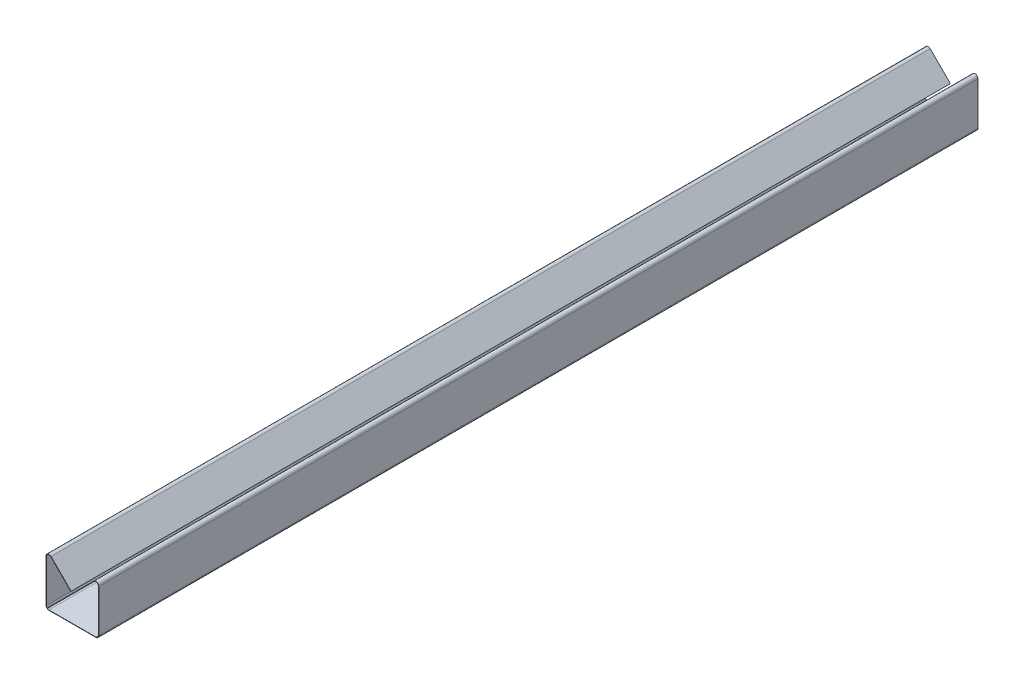
ISO-10303-21;
HEADER;
FILE_DESCRIPTION(('STEP AP214'),'2;1');
FILE_NAME('part.step','',(''),(''),'','','');
FILE_SCHEMA(('AUTOMOTIVE_DESIGN { 1 0 10303 214 1 1 1 1 }'));
ENDSEC;
DATA;
#1=APPLICATION_CONTEXT('core data for automotive mechanical design processes');
#2=APPLICATION_PROTOCOL_DEFINITION('international standard','automotive_design',2000,#1);
#3=PRODUCT_CONTEXT('',#1,'mechanical');
#4=PRODUCT('Part','Part','',(#3));
#5=PRODUCT_RELATED_PRODUCT_CATEGORY('part','',(#4));
#6=PRODUCT_DEFINITION_FORMATION('','',#4);
#7=PRODUCT_DEFINITION_CONTEXT('part definition',#1,'design');
#8=PRODUCT_DEFINITION('design','',#6,#7);
#9=PRODUCT_DEFINITION_SHAPE('','',#8);
#10=(LENGTH_UNIT() NAMED_UNIT(*) SI_UNIT(.MILLI.,.METRE.));
#11=(NAMED_UNIT(*) PLANE_ANGLE_UNIT() SI_UNIT($,.RADIAN.));
#12=(NAMED_UNIT(*) SI_UNIT($,.STERADIAN.) SOLID_ANGLE_UNIT());
#13=UNCERTAINTY_MEASURE_WITH_UNIT(LENGTH_MEASURE(1.E-05),#10,'distance_accuracy_value','');
#14=(GEOMETRIC_REPRESENTATION_CONTEXT(3) GLOBAL_UNCERTAINTY_ASSIGNED_CONTEXT((#13)) GLOBAL_UNIT_ASSIGNED_CONTEXT((#10,
#11,#12)) REPRESENTATION_CONTEXT('',''));
#15=CARTESIAN_POINT('',(0.,0.,0.));
#16=DIRECTION('',(0.,0.,1.));
#17=DIRECTION('',(1.,0.,0.));
#18=AXIS2_PLACEMENT_3D('',#15,#16,#17);
#19=CARTESIAN_POINT('',(7.49999999999994,5.48026893371868,250.));
#20=DIRECTION('',(0.,0.,1.));
#21=DIRECTION('',(1.,0.,0.));
#22=AXIS2_PLACEMENT_3D('',#19,#20,#21);
#23=PLANE('',#22);
#24=DIRECTION('',(-1.,0.,0.));
#25=VECTOR('',#24,1.);
#26=CARTESIAN_POINT('',(7.49999999999994,5.48026893371868,250.));
#27=LINE('',#26,#25);
#28=CARTESIAN_POINT('',(7.49999999999994,5.48026893371868,250.));
#29=VERTEX_POINT('',#28);
#30=CARTESIAN_POINT('',(7.39999999999994,5.48026893371868,250.));
#31=VERTEX_POINT('',#30);
#32=EDGE_CURVE('E11',#29,#31,#27,.T.);
#33=ORIENTED_EDGE('',*,*,#32,.F.);
#34=CARTESIAN_POINT('',(6.66339999999994,5.48026893371868,250.));
#35=DIRECTION('',(0.,0.,1.));
#36=DIRECTION('',(1.,0.,0.));
#37=AXIS2_PLACEMENT_3D('',#34,#35,#36);
#38=CIRCLE('',#37,0.8366);
#39=CARTESIAN_POINT('',(6.07183446685927,6.07183446685934,250.));
#40=VERTEX_POINT('',#39);
#41=EDGE_CURVE('E364',#40,#29,#38,.F.);
#42=ORIENTED_EDGE('',*,*,#41,.F.);
#43=DIRECTION('',(-0.707106781186552,0.707106781186543,0.));
#44=VECTOR('',#43,1.);
#45=CARTESIAN_POINT('',(6.14254514497793,6.00112378874069,250.));
#46=LINE('',#45,#44);
#47=CARTESIAN_POINT('',(6.14254514497793,6.00112378874069,250.));
#48=VERTEX_POINT('',#47);
#49=EDGE_CURVE('E43',#48,#40,#46,.T.);
#50=ORIENTED_EDGE('',*,*,#49,.F.);
#51=CARTESIAN_POINT('',(6.66339999999994,5.48026893371868,250.));
#52=DIRECTION('',(0.,0.,1.));
#53=DIRECTION('',(1.,0.,0.));
#54=AXIS2_PLACEMENT_3D('',#51,#52,#53);
#55=CIRCLE('',#54,0.7366);
#56=EDGE_CURVE('E377',#48,#31,#55,.F.);
#57=ORIENTED_EDGE('',*,*,#56,.T.);
#58=EDGE_LOOP('',(#33,#42,#50,#57));
#59=FACE_BOUND('',#58,.T.);
#60=ADVANCED_FACE('F35',(#59),#23,.T.);
#61=CARTESIAN_POINT('',(6.14254514497793,6.00112378874069,250.));
#62=DIRECTION('',(0.,0.,1.));
#63=DIRECTION('',(1.,0.,0.));
#64=AXIS2_PLACEMENT_3D('',#61,#62,#63);
#65=PLANE('',#64);
#66=DIRECTION('',(0.,-1.,0.));
#67=VECTOR('',#66,1.);
#68=CARTESIAN_POINT('',(7.49999999999994,-7.49999999999997,250.));
#69=LINE('',#68,#67);
#70=CARTESIAN_POINT('',(7.49999999999994,-6.66339999999997,250.));
#71=VERTEX_POINT('',#70);
#72=EDGE_CURVE('E368',#29,#71,#69,.T.);
#73=ORIENTED_EDGE('',*,*,#72,.F.);
#74=ORIENTED_EDGE('',*,*,#32,.T.);
#75=DIRECTION('',(0.,1.,0.));
#76=VECTOR('',#75,1.);
#77=CARTESIAN_POINT('',(7.39999999999994,-7.49999999999997,250.));
#78=LINE('',#77,#76);
#79=CARTESIAN_POINT('',(7.39999999999994,-6.66339999999997,250.));
#80=VERTEX_POINT('',#79);
#81=EDGE_CURVE('E379',#31,#80,#78,.F.);
#82=ORIENTED_EDGE('',*,*,#81,.T.);
#83=DIRECTION('',(1.,0.,0.));
#84=VECTOR('',#83,1.);
#85=CARTESIAN_POINT('',(7.39999999999994,-6.66339999999997,250.));
#86=LINE('',#85,#84);
#87=EDGE_CURVE('E338',#80,#71,#86,.T.);
#88=ORIENTED_EDGE('',*,*,#87,.T.);
#89=EDGE_LOOP('',(#73,#74,#82,#88));
#90=FACE_BOUND('',#89,.T.);
#91=ADVANCED_FACE('F448',(#90),#65,.T.);
#92=CARTESIAN_POINT('',(6.07183446685927,6.07183446685934,0.));
#93=DIRECTION('',(0.,0.,-1.));
#94=DIRECTION('',(-1.,0.,0.));
#95=AXIS2_PLACEMENT_3D('',#92,#93,#94);
#96=PLANE('',#95);
#97=DIRECTION('',(0.707106781186552,-0.707106781186543,0.));
#98=VECTOR('',#97,1.);
#99=CARTESIAN_POINT('',(6.07183446685927,6.07183446685934,0.));
#100=LINE('',#99,#98);
#101=CARTESIAN_POINT('',(6.07183446685927,6.07183446685934,0.));
#102=VERTEX_POINT('',#101);
#103=CARTESIAN_POINT('',(6.14254514497793,6.00112378874069,0.));
#104=VERTEX_POINT('',#103);
#105=EDGE_CURVE('E344',#102,#104,#100,.T.);
#106=ORIENTED_EDGE('',*,*,#105,.F.);
#107=CARTESIAN_POINT('',(6.66339999999994,5.48026893371868,0.));
#108=DIRECTION('',(0.,0.,1.));
#109=DIRECTION('',(1.,0.,0.));
#110=AXIS2_PLACEMENT_3D('',#107,#108,#109);
#111=CIRCLE('',#110,0.8366);
#112=CARTESIAN_POINT('',(7.49999999999994,5.48026893371868,0.));
#113=VERTEX_POINT('',#112);
#114=EDGE_CURVE('E248',#102,#113,#111,.F.);
#115=ORIENTED_EDGE('',*,*,#114,.T.);
#116=DIRECTION('',(1.,0.,0.));
#117=VECTOR('',#116,1.);
#118=CARTESIAN_POINT('',(7.39999999999994,5.48026893371868,0.));
#119=LINE('',#118,#117);
#120=CARTESIAN_POINT('',(7.39999999999994,5.48026893371868,0.));
#121=VERTEX_POINT('',#120);
#122=EDGE_CURVE('E342',#121,#113,#119,.T.);
#123=ORIENTED_EDGE('',*,*,#122,.F.);
#124=CARTESIAN_POINT('',(6.66339999999994,5.48026893371868,0.));
#125=DIRECTION('',(0.,0.,1.));
#126=DIRECTION('',(1.,0.,0.));
#127=AXIS2_PLACEMENT_3D('',#124,#125,#126);
#128=CIRCLE('',#127,0.7366);
#129=EDGE_CURVE('E260',#104,#121,#128,.F.);
#130=ORIENTED_EDGE('',*,*,#129,.F.);
#131=EDGE_LOOP('',(#106,#115,#123,#130));
#132=FACE_BOUND('',#131,.T.);
#133=ADVANCED_FACE('F490',(#132),#96,.T.);
#134=CARTESIAN_POINT('',(7.39999999999994,5.48026893371868,0.));
#135=DIRECTION('',(0.,0.,-1.));
#136=DIRECTION('',(-1.,0.,0.));
#137=AXIS2_PLACEMENT_3D('',#134,#135,#136);
#138=PLANE('',#137);
#139=DIRECTION('',(0.707106781186544,0.707106781186551,0.));
#140=VECTOR('',#139,1.);
#141=CARTESIAN_POINT('',(7.49999999999994,7.50000000000003,0.));
#142=LINE('',#141,#140);
#143=CARTESIAN_POINT('',(-7.1464466094067,-7.14644660940678,0.));
#144=VERTEX_POINT('',#143);
#145=EDGE_CURVE('E251',#144,#102,#142,.T.);
#146=ORIENTED_EDGE('',*,*,#145,.T.);
#147=ORIENTED_EDGE('',*,*,#105,.T.);
#148=DIRECTION('',(0.707106781186544,0.707106781186551,0.));
#149=VECTOR('',#148,1.);
#150=CARTESIAN_POINT('',(7.5707106781186,7.42928932188137,0.));
#151=LINE('',#150,#149);
#152=CARTESIAN_POINT('',(-7.07573593128805,-7.21715728752544,0.));
#153=VERTEX_POINT('',#152);
#154=EDGE_CURVE('E257',#153,#104,#151,.T.);
#155=ORIENTED_EDGE('',*,*,#154,.F.);
#156=DIRECTION('',(-0.707106781186487,0.707106781186608,0.));
#157=VECTOR('',#156,1.);
#158=CARTESIAN_POINT('',(-7.07573593128805,-7.21715728752544,0.));
#159=LINE('',#158,#157);
#160=EDGE_CURVE('E254',#153,#144,#159,.T.);
#161=ORIENTED_EDGE('',*,*,#160,.T.);
#162=EDGE_LOOP('',(#146,#147,#155,#161));
#163=FACE_BOUND('',#162,.T.);
#164=ADVANCED_FACE('F494',(#163),#138,.T.);
#165=CARTESIAN_POINT('',(6.66339999999994,-7.49999999999997,250.));
#166=DIRECTION('',(0.,0.,1.));
#167=DIRECTION('',(1.,0.,0.));
#168=AXIS2_PLACEMENT_3D('',#165,#166,#167);
#169=PLANE('',#168);
#170=DIRECTION('',(0.,1.,0.));
#171=VECTOR('',#170,1.);
#172=CARTESIAN_POINT('',(6.66339999999994,-7.49999999999997,250.));
#173=LINE('',#172,#171);
#174=CARTESIAN_POINT('',(6.66339999999994,-7.49999999999997,250.));
#175=VERTEX_POINT('',#174);
#176=CARTESIAN_POINT('',(6.66339999999994,-7.39999999999997,250.));
#177=VERTEX_POINT('',#176);
#178=EDGE_CURVE('E340',#175,#177,#173,.T.);
#179=ORIENTED_EDGE('',*,*,#178,.F.);
#180=CARTESIAN_POINT('',(6.66339999999994,-6.66339999999997,250.));
#181=DIRECTION('',(0.,0.,1.));
#182=DIRECTION('',(1.,0.,0.));
#183=AXIS2_PLACEMENT_3D('',#180,#181,#182);
#184=CIRCLE('',#183,0.8366);
#185=EDGE_CURVE('E438',#71,#175,#184,.F.);
#186=ORIENTED_EDGE('',*,*,#185,.F.);
#187=ORIENTED_EDGE('',*,*,#87,.F.);
#188=CARTESIAN_POINT('',(6.66339999999994,-6.66339999999997,250.));
#189=DIRECTION('',(0.,0.,1.));
#190=DIRECTION('',(1.,0.,0.));
#191=AXIS2_PLACEMENT_3D('',#188,#189,#190);
#192=CIRCLE('',#191,0.7366);
#193=EDGE_CURVE('E382',#80,#177,#192,.F.);
#194=ORIENTED_EDGE('',*,*,#193,.T.);
#195=EDGE_LOOP('',(#179,#186,#187,#194));
#196=FACE_BOUND('',#195,.T.);
#197=ADVANCED_FACE('F455',(#196),#169,.T.);
#198=CARTESIAN_POINT('',(7.39999999999994,-6.66339999999997,250.));
#199=DIRECTION('',(0.,0.,1.));
#200=DIRECTION('',(1.,0.,0.));
#201=AXIS2_PLACEMENT_3D('',#198,#199,#200);
#202=PLANE('',#201);
#203=DIRECTION('',(-1.,0.,0.));
#204=VECTOR('',#203,1.);
#205=CARTESIAN_POINT('',(-7.50000000000006,-7.49999999999997,250.));
#206=LINE('',#205,#204);
#207=CARTESIAN_POINT('',(-6.66340000000006,-7.49999999999997,250.));
#208=VERTEX_POINT('',#207);
#209=EDGE_CURVE('E435',#175,#208,#206,.T.);
#210=ORIENTED_EDGE('',*,*,#209,.F.);
#211=ORIENTED_EDGE('',*,*,#178,.T.);
#212=DIRECTION('',(1.,0.,0.));
#213=VECTOR('',#212,1.);
#214=CARTESIAN_POINT('',(-7.50000000000006,-7.39999999999997,250.));
#215=LINE('',#214,#213);
#216=CARTESIAN_POINT('',(-6.66340000000006,-7.39999999999997,250.));
#217=VERTEX_POINT('',#216);
#218=EDGE_CURVE('E202',#177,#217,#215,.F.);
#219=ORIENTED_EDGE('',*,*,#218,.T.);
#220=DIRECTION('',(0.,-1.,0.));
#221=VECTOR('',#220,1.);
#222=CARTESIAN_POINT('',(-6.66340000000006,-7.39999999999997,250.));
#223=LINE('',#222,#221);
#224=EDGE_CURVE('E193',#217,#208,#223,.T.);
#225=ORIENTED_EDGE('',*,*,#224,.T.);
#226=EDGE_LOOP('',(#210,#211,#219,#225));
#227=FACE_BOUND('',#226,.T.);
#228=ADVANCED_FACE('F388',(#227),#202,.T.);
#229=CARTESIAN_POINT('',(7.49999999999994,-6.66339999999997,0.));
#230=DIRECTION('',(0.,0.,-1.));
#231=DIRECTION('',(-1.,0.,0.));
#232=AXIS2_PLACEMENT_3D('',#229,#230,#231);
#233=PLANE('',#232);
#234=DIRECTION('',(-1.,0.,0.));
#235=VECTOR('',#234,1.);
#236=CARTESIAN_POINT('',(7.49999999999994,-6.66339999999997,0.));
#237=LINE('',#236,#235);
#238=CARTESIAN_POINT('',(7.49999999999994,-6.66339999999997,0.));
#239=VERTEX_POINT('',#238);
#240=CARTESIAN_POINT('',(7.39999999999994,-6.66339999999997,0.));
#241=VERTEX_POINT('',#240);
#242=EDGE_CURVE('E336',#239,#241,#237,.T.);
#243=ORIENTED_EDGE('',*,*,#242,.F.);
#244=CARTESIAN_POINT('',(6.66339999999994,-6.66339999999997,0.));
#245=DIRECTION('',(0.,0.,1.));
#246=DIRECTION('',(1.,0.,0.));
#247=AXIS2_PLACEMENT_3D('',#244,#245,#246);
#248=CIRCLE('',#247,0.8366);
#249=CARTESIAN_POINT('',(6.66339999999994,-7.49999999999997,0.));
#250=VERTEX_POINT('',#249);
#251=EDGE_CURVE('E242',#239,#250,#248,.F.);
#252=ORIENTED_EDGE('',*,*,#251,.T.);
#253=DIRECTION('',(0.,-1.,0.));
#254=VECTOR('',#253,1.);
#255=CARTESIAN_POINT('',(6.66339999999994,-7.39999999999997,0.));
#256=LINE('',#255,#254);
#257=CARTESIAN_POINT('',(6.66339999999994,-7.39999999999997,0.));
#258=VERTEX_POINT('',#257);
#259=EDGE_CURVE('E192',#258,#250,#256,.T.);
#260=ORIENTED_EDGE('',*,*,#259,.F.);
#261=CARTESIAN_POINT('',(6.66339999999994,-6.66339999999997,0.));
#262=DIRECTION('',(0.,0.,1.));
#263=DIRECTION('',(1.,0.,0.));
#264=AXIS2_PLACEMENT_3D('',#261,#262,#263);
#265=CIRCLE('',#264,0.7366);
#266=EDGE_CURVE('E266',#241,#258,#265,.F.);
#267=ORIENTED_EDGE('',*,*,#266,.F.);
#268=EDGE_LOOP('',(#243,#252,#260,#267));
#269=FACE_BOUND('',#268,.T.);
#270=ADVANCED_FACE('F464',(#269),#233,.T.);
#271=CARTESIAN_POINT('',(6.66339999999994,-7.39999999999997,0.));
#272=DIRECTION('',(0.,0.,-1.));
#273=DIRECTION('',(-1.,0.,0.));
#274=AXIS2_PLACEMENT_3D('',#271,#272,#273);
#275=PLANE('',#274);
#276=DIRECTION('',(0.,-1.,0.));
#277=VECTOR('',#276,1.);
#278=CARTESIAN_POINT('',(7.49999999999994,-7.49999999999997,0.));
#279=LINE('',#278,#277);
#280=EDGE_CURVE('E245',#113,#239,#279,.T.);
#281=ORIENTED_EDGE('',*,*,#280,.T.);
#282=ORIENTED_EDGE('',*,*,#242,.T.);
#283=DIRECTION('',(0.,1.,0.));
#284=VECTOR('',#283,1.);
#285=CARTESIAN_POINT('',(7.39999999999994,-7.49999999999997,0.));
#286=LINE('',#285,#284);
#287=EDGE_CURVE('E263',#121,#241,#286,.F.);
#288=ORIENTED_EDGE('',*,*,#287,.F.);
#289=ORIENTED_EDGE('',*,*,#122,.T.);
#290=EDGE_LOOP('',(#281,#282,#288,#289));
#291=FACE_BOUND('',#290,.T.);
#292=ADVANCED_FACE('F468',(#291),#275,.T.);
#293=CARTESIAN_POINT('',(-7.50000000000006,-6.66339999999997,250.));
#294=DIRECTION('',(0.,0.,1.));
#295=DIRECTION('',(1.,0.,0.));
#296=AXIS2_PLACEMENT_3D('',#293,#294,#295);
#297=PLANE('',#296);
#298=DIRECTION('',(1.,0.,0.));
#299=VECTOR('',#298,1.);
#300=CARTESIAN_POINT('',(-7.50000000000006,-6.66339999999997,250.));
#301=LINE('',#300,#299);
#302=CARTESIAN_POINT('',(-7.50000000000006,-6.66339999999997,250.));
#303=VERTEX_POINT('',#302);
#304=CARTESIAN_POINT('',(-7.40000000000005,-6.66339999999997,250.));
#305=VERTEX_POINT('',#304);
#306=EDGE_CURVE('E180',#303,#305,#301,.T.);
#307=ORIENTED_EDGE('',*,*,#306,.F.);
#308=CARTESIAN_POINT('',(-6.66340000000006,-6.66339999999997,250.));
#309=DIRECTION('',(0.,0.,1.));
#310=DIRECTION('',(1.,0.,0.));
#311=AXIS2_PLACEMENT_3D('',#308,#309,#310);
#312=CIRCLE('',#311,0.8366);
#313=EDGE_CURVE('E400',#208,#303,#312,.F.);
#314=ORIENTED_EDGE('',*,*,#313,.F.);
#315=ORIENTED_EDGE('',*,*,#224,.F.);
#316=CARTESIAN_POINT('',(-6.66340000000006,-6.66339999999997,250.));
#317=DIRECTION('',(0.,0.,1.));
#318=DIRECTION('',(1.,0.,0.));
#319=AXIS2_PLACEMENT_3D('',#316,#317,#318);
#320=CIRCLE('',#319,0.7366);
#321=EDGE_CURVE('E196',#217,#305,#320,.F.);
#322=ORIENTED_EDGE('',*,*,#321,.T.);
#323=EDGE_LOOP('',(#307,#314,#315,#322));
#324=FACE_BOUND('',#323,.T.);
#325=ADVANCED_FACE('F198',(#324),#297,.T.);
#326=CARTESIAN_POINT('',(-6.66340000000006,-7.39999999999997,250.));
#327=DIRECTION('',(0.,0.,1.));
#328=DIRECTION('',(1.,0.,0.));
#329=AXIS2_PLACEMENT_3D('',#326,#327,#328);
#330=PLANE('',#329);
#331=DIRECTION('',(0.,1.,0.));
#332=VECTOR('',#331,1.);
#333=CARTESIAN_POINT('',(-7.50000000000006,7.50000000000003,250.));
#334=LINE('',#333,#332);
#335=CARTESIAN_POINT('',(-7.50000000000006,5.4802689337187,250.));
#336=VERTEX_POINT('',#335);
#337=EDGE_CURVE('E187',#303,#336,#334,.T.);
#338=ORIENTED_EDGE('',*,*,#337,.F.);
#339=ORIENTED_EDGE('',*,*,#306,.T.);
#340=DIRECTION('',(0.,1.,0.));
#341=VECTOR('',#340,1.);
#342=CARTESIAN_POINT('',(-7.40000000000006,7.50000000000003,250.));
#343=LINE('',#342,#341);
#344=CARTESIAN_POINT('',(-7.40000000000006,5.4802689337187,250.));
#345=VERTEX_POINT('',#344);
#346=EDGE_CURVE('E184',#305,#345,#343,.T.);
#347=ORIENTED_EDGE('',*,*,#346,.T.);
#348=DIRECTION('',(-1.,0.,0.));
#349=VECTOR('',#348,1.);
#350=CARTESIAN_POINT('',(-7.40000000000006,5.4802689337187,250.));
#351=LINE('',#350,#349);
#352=EDGE_CURVE('E327',#345,#336,#351,.T.);
#353=ORIENTED_EDGE('',*,*,#352,.T.);
#354=EDGE_LOOP('',(#338,#339,#347,#353));
#355=FACE_BOUND('',#354,.T.);
#356=ADVANCED_FACE('F182',(#355),#330,.T.);
#357=CARTESIAN_POINT('',(-6.66340000000006,-7.49999999999997,0.));
#358=DIRECTION('',(0.,0.,-1.));
#359=DIRECTION('',(-1.,0.,0.));
#360=AXIS2_PLACEMENT_3D('',#357,#358,#359);
#361=PLANE('',#360);
#362=DIRECTION('',(0.,1.,0.));
#363=VECTOR('',#362,1.);
#364=CARTESIAN_POINT('',(-6.66340000000006,-7.49999999999997,0.));
#365=LINE('',#364,#363);
#366=CARTESIAN_POINT('',(-6.66340000000006,-7.49999999999997,0.));
#367=VERTEX_POINT('',#366);
#368=CARTESIAN_POINT('',(-6.66340000000006,-7.39999999999997,0.));
#369=VERTEX_POINT('',#368);
#370=EDGE_CURVE('E332',#367,#369,#365,.T.);
#371=ORIENTED_EDGE('',*,*,#370,.F.);
#372=CARTESIAN_POINT('',(-6.66340000000006,-6.66339999999997,0.));
#373=DIRECTION('',(0.,0.,1.));
#374=DIRECTION('',(1.,0.,0.));
#375=AXIS2_PLACEMENT_3D('',#372,#373,#374);
#376=CIRCLE('',#375,0.8366);
#377=CARTESIAN_POINT('',(-7.50000000000006,-6.66339999999997,0.));
#378=VERTEX_POINT('',#377);
#379=EDGE_CURVE('E236',#367,#378,#376,.F.);
#380=ORIENTED_EDGE('',*,*,#379,.T.);
#381=DIRECTION('',(-1.,0.,0.));
#382=VECTOR('',#381,1.);
#383=CARTESIAN_POINT('',(-7.40000000000005,-6.66339999999997,0.));
#384=LINE('',#383,#382);
#385=CARTESIAN_POINT('',(-7.40000000000005,-6.66339999999997,0.));
#386=VERTEX_POINT('',#385);
#387=EDGE_CURVE('E330',#386,#378,#384,.T.);
#388=ORIENTED_EDGE('',*,*,#387,.F.);
#389=CARTESIAN_POINT('',(-6.66340000000006,-6.66339999999997,0.));
#390=DIRECTION('',(0.,0.,1.));
#391=DIRECTION('',(1.,0.,0.));
#392=AXIS2_PLACEMENT_3D('',#389,#390,#391);
#393=CIRCLE('',#392,0.7366);
#394=EDGE_CURVE('E209',#369,#386,#393,.F.);
#395=ORIENTED_EDGE('',*,*,#394,.F.);
#396=EDGE_LOOP('',(#371,#380,#388,#395));
#397=FACE_BOUND('',#396,.T.);
#398=ADVANCED_FACE('F394',(#397),#361,.T.);
#399=CARTESIAN_POINT('',(-7.40000000000005,-6.66339999999997,0.));
#400=DIRECTION('',(0.,0.,-1.));
#401=DIRECTION('',(-1.,0.,0.));
#402=AXIS2_PLACEMENT_3D('',#399,#400,#401);
#403=PLANE('',#402);
#404=DIRECTION('',(-1.,0.,0.));
#405=VECTOR('',#404,1.);
#406=CARTESIAN_POINT('',(-7.50000000000006,-7.49999999999997,0.));
#407=LINE('',#406,#405);
#408=EDGE_CURVE('E239',#250,#367,#407,.T.);
#409=ORIENTED_EDGE('',*,*,#408,.T.);
#410=ORIENTED_EDGE('',*,*,#370,.T.);
#411=DIRECTION('',(1.,0.,0.));
#412=VECTOR('',#411,1.);
#413=CARTESIAN_POINT('',(-7.50000000000006,-7.39999999999997,0.));
#414=LINE('',#413,#412);
#415=EDGE_CURVE('E269',#258,#369,#414,.F.);
#416=ORIENTED_EDGE('',*,*,#415,.F.);
#417=ORIENTED_EDGE('',*,*,#259,.T.);
#418=EDGE_LOOP('',(#409,#410,#416,#417));
#419=FACE_BOUND('',#418,.T.);
#420=ADVANCED_FACE('F474',(#419),#403,.T.);
#421=CARTESIAN_POINT('',(-6.07183446685939,6.07183446685937,250.));
#422=DIRECTION('',(0.,0.,1.));
#423=DIRECTION('',(1.,0.,0.));
#424=AXIS2_PLACEMENT_3D('',#421,#422,#423);
#425=PLANE('',#424);
#426=DIRECTION('',(-0.707106781186548,-0.707106781186548,0.));
#427=VECTOR('',#426,1.);
#428=CARTESIAN_POINT('',(-6.07183446685939,6.07183446685937,250.));
#429=LINE('',#428,#427);
#430=CARTESIAN_POINT('',(-6.07183446685939,6.07183446685937,250.));
#431=VERTEX_POINT('',#430);
#432=CARTESIAN_POINT('',(-6.14254514497805,6.00112378874071,250.));
#433=VERTEX_POINT('',#432);
#434=EDGE_CURVE('E51',#431,#433,#429,.T.);
#435=ORIENTED_EDGE('',*,*,#434,.F.);
#436=CARTESIAN_POINT('',(-6.66340000000006,5.4802689337187,250.));
#437=DIRECTION('',(0.,0.,1.));
#438=DIRECTION('',(1.,0.,0.));
#439=AXIS2_PLACEMENT_3D('',#436,#437,#438);
#440=CIRCLE('',#439,0.8366);
#441=EDGE_CURVE('E428',#336,#431,#440,.F.);
#442=ORIENTED_EDGE('',*,*,#441,.F.);
#443=ORIENTED_EDGE('',*,*,#352,.F.);
#444=CARTESIAN_POINT('',(-6.66340000000006,5.4802689337187,250.));
#445=DIRECTION('',(0.,0.,1.));
#446=DIRECTION('',(1.,0.,0.));
#447=AXIS2_PLACEMENT_3D('',#444,#445,#446);
#448=CIRCLE('',#447,0.7366);
#449=EDGE_CURVE('E217',#345,#433,#448,.F.);
#450=ORIENTED_EDGE('',*,*,#449,.T.);
#451=EDGE_LOOP('',(#435,#442,#443,#450));
#452=FACE_BOUND('',#451,.T.);
#453=ADVANCED_FACE('F476',(#452),#425,.T.);
#454=CARTESIAN_POINT('',(-7.40000000000006,5.4802689337187,250.));
#455=DIRECTION('',(0.,0.,1.));
#456=DIRECTION('',(1.,0.,0.));
#457=AXIS2_PLACEMENT_3D('',#454,#455,#456);
#458=PLANE('',#457);
#459=DIRECTION('',(0.707106781186549,-0.707106781186546,0.));
#460=VECTOR('',#459,1.);
#461=CARTESIAN_POINT('',(-7.50000000000006,7.50000000000003,250.));
#462=LINE('',#461,#460);
#463=CARTESIAN_POINT('',(-0.353553390593274,0.353553390593273,250.));
#464=VERTEX_POINT('',#463);
#465=EDGE_CURVE('E426',#431,#464,#462,.T.);
#466=ORIENTED_EDGE('',*,*,#465,.F.);
#467=ORIENTED_EDGE('',*,*,#434,.T.);
#468=DIRECTION('',(0.707106781186549,-0.707106781186546,0.));
#469=VECTOR('',#468,1.);
#470=CARTESIAN_POINT('',(-7.57071067811871,7.42928932188137,250.));
#471=LINE('',#470,#469);
#472=CARTESIAN_POINT('',(-0.42426406871193,0.282842712474619,250.));
#473=VERTEX_POINT('',#472);
#474=EDGE_CURVE('E129',#433,#473,#471,.T.);
#475=ORIENTED_EDGE('',*,*,#474,.T.);
#476=DIRECTION('',(-0.707106781186556,-0.707106781186539,0.));
#477=VECTOR('',#476,1.);
#478=CARTESIAN_POINT('',(-0.353553390593274,0.353553390593273,250.));
#479=LINE('',#478,#477);
#480=EDGE_CURVE('E424',#464,#473,#479,.T.);
#481=ORIENTED_EDGE('',*,*,#480,.F.);
#482=EDGE_LOOP('',(#466,#467,#475,#481));
#483=FACE_BOUND('',#482,.T.);
#484=ADVANCED_FACE('F482',(#483),#458,.T.);
#485=CARTESIAN_POINT('',(-7.50000000000006,5.4802689337187,0.));
#486=DIRECTION('',(0.,0.,-1.));
#487=DIRECTION('',(-1.,0.,0.));
#488=AXIS2_PLACEMENT_3D('',#485,#486,#487);
#489=PLANE('',#488);
#490=DIRECTION('',(1.,0.,0.));
#491=VECTOR('',#490,1.);
#492=CARTESIAN_POINT('',(-7.50000000000006,5.4802689337187,0.));
#493=LINE('',#492,#491);
#494=CARTESIAN_POINT('',(-7.50000000000006,5.4802689337187,0.));
#495=VERTEX_POINT('',#494);
#496=CARTESIAN_POINT('',(-7.40000000000006,5.4802689337187,0.));
#497=VERTEX_POINT('',#496);
#498=EDGE_CURVE('E116',#495,#497,#493,.T.);
#499=ORIENTED_EDGE('',*,*,#498,.F.);
#500=CARTESIAN_POINT('',(-6.66340000000006,5.4802689337187,0.));
#501=DIRECTION('',(0.,0.,1.));
#502=DIRECTION('',(1.,0.,0.));
#503=AXIS2_PLACEMENT_3D('',#500,#501,#502);
#504=CIRCLE('',#503,0.8366);
#505=CARTESIAN_POINT('',(-6.07183446685939,6.07183446685937,0.));
#506=VERTEX_POINT('',#505);
#507=EDGE_CURVE('E232',#495,#506,#504,.F.);
#508=ORIENTED_EDGE('',*,*,#507,.T.);
#509=DIRECTION('',(0.707106781186548,0.707106781186548,0.));
#510=VECTOR('',#509,1.);
#511=CARTESIAN_POINT('',(-6.14254514497805,6.00112378874071,0.));
#512=LINE('',#511,#510);
#513=CARTESIAN_POINT('',(-6.14254514497805,6.00112378874071,0.));
#514=VERTEX_POINT('',#513);
#515=EDGE_CURVE('E123',#514,#506,#512,.T.);
#516=ORIENTED_EDGE('',*,*,#515,.F.);
#517=CARTESIAN_POINT('',(-6.66340000000006,5.4802689337187,0.));
#518=DIRECTION('',(0.,0.,1.));
#519=DIRECTION('',(1.,0.,0.));
#520=AXIS2_PLACEMENT_3D('',#517,#518,#519);
#521=CIRCLE('',#520,0.7366);
#522=EDGE_CURVE('E275',#497,#514,#521,.F.);
#523=ORIENTED_EDGE('',*,*,#522,.F.);
#524=EDGE_LOOP('',(#499,#508,#516,#523));
#525=FACE_BOUND('',#524,.T.);
#526=ADVANCED_FACE('F411',(#525),#489,.T.);
#527=CARTESIAN_POINT('',(-6.14254514497805,6.00112378874071,0.));
#528=DIRECTION('',(0.,0.,-1.));
#529=DIRECTION('',(-1.,0.,0.));
#530=AXIS2_PLACEMENT_3D('',#527,#528,#529);
#531=PLANE('',#530);
#532=DIRECTION('',(0.,1.,0.));
#533=VECTOR('',#532,1.);
#534=CARTESIAN_POINT('',(-7.50000000000006,7.50000000000003,0.));
#535=LINE('',#534,#533);
#536=EDGE_CURVE('E234',#378,#495,#535,.T.);
#537=ORIENTED_EDGE('',*,*,#536,.T.);
#538=ORIENTED_EDGE('',*,*,#498,.T.);
#539=DIRECTION('',(0.,1.,0.));
#540=VECTOR('',#539,1.);
#541=CARTESIAN_POINT('',(-7.40000000000006,7.50000000000003,0.));
#542=LINE('',#541,#540);
#543=EDGE_CURVE('E273',#386,#497,#542,.T.);
#544=ORIENTED_EDGE('',*,*,#543,.F.);
#545=ORIENTED_EDGE('',*,*,#387,.T.);
#546=EDGE_LOOP('',(#537,#538,#544,#545));
#547=FACE_BOUND('',#546,.T.);
#548=ADVANCED_FACE('F396',(#547),#531,.T.);
#549=CARTESIAN_POINT('',(-7.57071067811871,7.42928932188137,250.));
#550=DIRECTION('',(0.707106781186546,0.707106781186549,0.));
#551=DIRECTION('',(-0.707106781186549,0.707106781186546,0.));
#552=AXIS2_PLACEMENT_3D('',#549,#550,#551);
#553=PLANE('',#552);
#554=DIRECTION('',(0.707106781186549,-0.707106781186546,0.));
#555=VECTOR('',#554,1.);
#556=CARTESIAN_POINT('',(-7.57071067811871,7.42928932188137,0.));
#557=LINE('',#556,#555);
#558=CARTESIAN_POINT('',(-0.42426406871193,0.282842712474619,0.));
#559=VERTEX_POINT('',#558);
#560=EDGE_CURVE('E223',#514,#559,#557,.T.);
#561=ORIENTED_EDGE('',*,*,#560,.T.);
#562=DIRECTION('',(0.,0.,-1.));
#563=VECTOR('',#562,1.);
#564=CARTESIAN_POINT('',(-0.42426406871193,0.282842712474619,250.));
#565=LINE('',#564,#563);
#566=EDGE_CURVE('E323',#473,#559,#565,.T.);
#567=ORIENTED_EDGE('',*,*,#566,.F.);
#568=ORIENTED_EDGE('',*,*,#474,.F.);
#569=DIRECTION('',(0.,0.,-1.));
#570=VECTOR('',#569,1.);
#571=CARTESIAN_POINT('',(-6.14254514497805,6.00112378874071,250.));
#572=LINE('',#571,#570);
#573=EDGE_CURVE('E219',#433,#514,#572,.T.);
#574=ORIENTED_EDGE('',*,*,#573,.T.);
#575=EDGE_LOOP('',(#561,#567,#568,#574));
#576=FACE_BOUND('',#575,.T.);
#577=ADVANCED_FACE('F417',(#576),#553,.F.);
#578=CARTESIAN_POINT('',(-0.353553390593274,0.353553390593273,250.));
#579=DIRECTION('',(0.707106781186539,-0.707106781186556,0.));
#580=DIRECTION('',(0.707106781186556,0.707106781186539,0.));
#581=AXIS2_PLACEMENT_3D('',#578,#579,#580);
#582=PLANE('',#581);
#583=DIRECTION('',(-0.707106781186556,-0.707106781186539,0.));
#584=VECTOR('',#583,1.);
#585=CARTESIAN_POINT('',(-0.353553390593274,0.353553390593273,0.));
#586=LINE('',#585,#584);
#587=CARTESIAN_POINT('',(-0.353553390593274,0.353553390593273,0.));
#588=VERTEX_POINT('',#587);
#589=EDGE_CURVE('E226',#588,#559,#586,.T.);
#590=ORIENTED_EDGE('',*,*,#589,.F.);
#591=DIRECTION('',(0.,0.,-1.));
#592=VECTOR('',#591,1.);
#593=CARTESIAN_POINT('',(-0.353553390593274,0.353553390593273,250.));
#594=LINE('',#593,#592);
#595=EDGE_CURVE('E321',#464,#588,#594,.T.);
#596=ORIENTED_EDGE('',*,*,#595,.F.);
#597=ORIENTED_EDGE('',*,*,#480,.T.);
#598=ORIENTED_EDGE('',*,*,#566,.T.);
#599=EDGE_LOOP('',(#590,#596,#597,#598));
#600=FACE_BOUND('',#599,.T.);
#601=ADVANCED_FACE('F422',(#600),#582,.T.);
#602=CARTESIAN_POINT('',(-7.50000000000006,7.50000000000003,250.));
#603=DIRECTION('',(0.707106781186546,0.707106781186549,0.));
#604=DIRECTION('',(-0.707106781186549,0.707106781186546,0.));
#605=AXIS2_PLACEMENT_3D('',#602,#603,#604);
#606=PLANE('',#605);
#607=DIRECTION('',(0.707106781186549,-0.707106781186546,0.));
#608=VECTOR('',#607,1.);
#609=CARTESIAN_POINT('',(-7.50000000000006,7.50000000000003,0.));
#610=LINE('',#609,#608);
#611=EDGE_CURVE('E229',#506,#588,#610,.T.);
#612=ORIENTED_EDGE('',*,*,#611,.F.);
#613=DIRECTION('',(0.,0.,-1.));
#614=VECTOR('',#613,1.);
#615=CARTESIAN_POINT('',(-6.07183446685939,6.07183446685937,250.));
#616=LINE('',#615,#614);
#617=EDGE_CURVE('E318',#431,#506,#616,.T.);
#618=ORIENTED_EDGE('',*,*,#617,.F.);
#619=ORIENTED_EDGE('',*,*,#465,.T.);
#620=ORIENTED_EDGE('',*,*,#595,.T.);
#621=EDGE_LOOP('',(#612,#618,#619,#620));
#622=FACE_BOUND('',#621,.T.);
#623=ADVANCED_FACE('F578',(#622),#606,.T.);
#624=CARTESIAN_POINT('',(-6.66340000000006,5.4802689337187,250.));
#625=DIRECTION('',(0.,0.,-1.));
#626=DIRECTION('',(-1.,0.,0.));
#627=AXIS2_PLACEMENT_3D('',#624,#625,#626);
#628=CYLINDRICAL_SURFACE('',#627,0.8366);
#629=ORIENTED_EDGE('',*,*,#507,.F.);
#630=DIRECTION('',(0.,0.,-1.));
#631=VECTOR('',#630,1.);
#632=CARTESIAN_POINT('',(-7.50000000000006,5.4802689337187,250.));
#633=LINE('',#632,#631);
#634=EDGE_CURVE('E315',#336,#495,#633,.T.);
#635=ORIENTED_EDGE('',*,*,#634,.F.);
#636=ORIENTED_EDGE('',*,*,#441,.T.);
#637=ORIENTED_EDGE('',*,*,#617,.T.);
#638=EDGE_LOOP('',(#629,#635,#636,#637));
#639=FACE_BOUND('',#638,.T.);
#640=ADVANCED_FACE('F408',(#639),#628,.T.);
#641=CARTESIAN_POINT('',(-7.50000000000006,7.50000000000003,250.));
#642=DIRECTION('',(-1.,0.,0.));
#643=DIRECTION('',(0.,-1.,0.));
#644=AXIS2_PLACEMENT_3D('',#641,#642,#643);
#645=PLANE('',#644);
#646=ORIENTED_EDGE('',*,*,#536,.F.);
#647=DIRECTION('',(0.,0.,-1.));
#648=VECTOR('',#647,1.);
#649=CARTESIAN_POINT('',(-7.50000000000006,-6.66339999999997,250.));
#650=LINE('',#649,#648);
#651=EDGE_CURVE('E312',#303,#378,#650,.T.);
#652=ORIENTED_EDGE('',*,*,#651,.F.);
#653=ORIENTED_EDGE('',*,*,#337,.T.);
#654=ORIENTED_EDGE('',*,*,#634,.T.);
#655=EDGE_LOOP('',(#646,#652,#653,#654));
#656=FACE_BOUND('',#655,.T.);
#657=ADVANCED_FACE('F402',(#656),#645,.T.);
#658=CARTESIAN_POINT('',(-6.66340000000006,-6.66339999999997,250.));
#659=DIRECTION('',(0.,0.,-1.));
#660=DIRECTION('',(-1.,0.,0.));
#661=AXIS2_PLACEMENT_3D('',#658,#659,#660);
#662=CYLINDRICAL_SURFACE('',#661,0.8366);
#663=ORIENTED_EDGE('',*,*,#379,.F.);
#664=DIRECTION('',(0.,0.,-1.));
#665=VECTOR('',#664,1.);
#666=CARTESIAN_POINT('',(-6.66340000000006,-7.49999999999997,250.));
#667=LINE('',#666,#665);
#668=EDGE_CURVE('E309',#208,#367,#667,.T.);
#669=ORIENTED_EDGE('',*,*,#668,.F.);
#670=ORIENTED_EDGE('',*,*,#313,.T.);
#671=ORIENTED_EDGE('',*,*,#651,.T.);
#672=EDGE_LOOP('',(#663,#669,#670,#671));
#673=FACE_BOUND('',#672,.T.);
#674=ADVANCED_FACE('F399',(#673),#662,.T.);
#675=CARTESIAN_POINT('',(-7.50000000000006,-7.49999999999997,250.));
#676=DIRECTION('',(0.,-1.,0.));
#677=DIRECTION('',(0.,0.,-1.));
#678=AXIS2_PLACEMENT_3D('',#675,#676,#677);
#679=PLANE('',#678);
#680=ORIENTED_EDGE('',*,*,#408,.F.);
#681=DIRECTION('',(0.,0.,-1.));
#682=VECTOR('',#681,1.);
#683=CARTESIAN_POINT('',(6.66339999999994,-7.49999999999997,250.));
#684=LINE('',#683,#682);
#685=EDGE_CURVE('E306',#175,#250,#684,.T.);
#686=ORIENTED_EDGE('',*,*,#685,.F.);
#687=ORIENTED_EDGE('',*,*,#209,.T.);
#688=ORIENTED_EDGE('',*,*,#668,.T.);
#689=EDGE_LOOP('',(#680,#686,#687,#688));
#690=FACE_BOUND('',#689,.T.);
#691=ADVANCED_FACE('F461',(#690),#679,.T.);
#692=CARTESIAN_POINT('',(6.66339999999994,-6.66339999999997,250.));
#693=DIRECTION('',(0.,0.,-1.));
#694=DIRECTION('',(-1.,0.,0.));
#695=AXIS2_PLACEMENT_3D('',#692,#693,#694);
#696=CYLINDRICAL_SURFACE('',#695,0.8366);
#697=ORIENTED_EDGE('',*,*,#251,.F.);
#698=DIRECTION('',(0.,0.,-1.));
#699=VECTOR('',#698,1.);
#700=CARTESIAN_POINT('',(7.49999999999994,-6.66339999999997,250.));
#701=LINE('',#700,#699);
#702=EDGE_CURVE('E303',#71,#239,#701,.T.);
#703=ORIENTED_EDGE('',*,*,#702,.F.);
#704=ORIENTED_EDGE('',*,*,#185,.T.);
#705=ORIENTED_EDGE('',*,*,#685,.T.);
#706=EDGE_LOOP('',(#697,#703,#704,#705));
#707=FACE_BOUND('',#706,.T.);
#708=ADVANCED_FACE('F454',(#707),#696,.T.);
#709=CARTESIAN_POINT('',(7.49999999999994,-7.49999999999997,250.));
#710=DIRECTION('',(1.,0.,0.));
#711=DIRECTION('',(0.,0.,-1.));
#712=AXIS2_PLACEMENT_3D('',#709,#710,#711);
#713=PLANE('',#712);
#714=ORIENTED_EDGE('',*,*,#280,.F.);
#715=DIRECTION('',(0.,0.,-1.));
#716=VECTOR('',#715,1.);
#717=CARTESIAN_POINT('',(7.49999999999994,5.48026893371868,250.));
#718=LINE('',#717,#716);
#719=EDGE_CURVE('E300',#29,#113,#718,.T.);
#720=ORIENTED_EDGE('',*,*,#719,.F.);
#721=ORIENTED_EDGE('',*,*,#72,.T.);
#722=ORIENTED_EDGE('',*,*,#702,.T.);
#723=EDGE_LOOP('',(#714,#720,#721,#722));
#724=FACE_BOUND('',#723,.T.);
#725=ADVANCED_FACE('F444',(#724),#713,.T.);
#726=CARTESIAN_POINT('',(6.66339999999994,5.48026893371868,250.));
#727=DIRECTION('',(0.,0.,-1.));
#728=DIRECTION('',(-1.,0.,0.));
#729=AXIS2_PLACEMENT_3D('',#726,#727,#728);
#730=CYLINDRICAL_SURFACE('',#729,0.8366);
#731=ORIENTED_EDGE('',*,*,#114,.F.);
#732=DIRECTION('',(0.,0.,-1.));
#733=VECTOR('',#732,1.);
#734=CARTESIAN_POINT('',(6.07183446685927,6.07183446685934,250.));
#735=LINE('',#734,#733);
#736=EDGE_CURVE('E297',#40,#102,#735,.T.);
#737=ORIENTED_EDGE('',*,*,#736,.F.);
#738=ORIENTED_EDGE('',*,*,#41,.T.);
#739=ORIENTED_EDGE('',*,*,#719,.T.);
#740=EDGE_LOOP('',(#731,#737,#738,#739));
#741=FACE_BOUND('',#740,.T.);
#742=ADVANCED_FACE('F363',(#741),#730,.T.);
#743=CARTESIAN_POINT('',(7.49999999999994,7.50000000000003,250.));
#744=DIRECTION('',(-0.707106781186551,0.707106781186544,0.));
#745=DIRECTION('',(-0.707106781186544,-0.707106781186551,0.));
#746=AXIS2_PLACEMENT_3D('',#743,#744,#745);
#747=PLANE('',#746);
#748=ORIENTED_EDGE('',*,*,#145,.F.);
#749=DIRECTION('',(0.,0.,-1.));
#750=VECTOR('',#749,1.);
#751=CARTESIAN_POINT('',(-7.1464466094067,-7.14644660940678,250.));
#752=LINE('',#751,#750);
#753=CARTESIAN_POINT('',(-7.1464466094067,-7.14644660940678,250.));
#754=VERTEX_POINT('',#753);
#755=EDGE_CURVE('E295',#754,#144,#752,.T.);
#756=ORIENTED_EDGE('',*,*,#755,.F.);
#757=DIRECTION('',(0.707106781186544,0.707106781186551,0.));
#758=VECTOR('',#757,1.);
#759=CARTESIAN_POINT('',(7.49999999999994,7.50000000000003,250.));
#760=LINE('',#759,#758);
#761=EDGE_CURVE('E352',#754,#40,#760,.T.);
#762=ORIENTED_EDGE('',*,*,#761,.T.);
#763=ORIENTED_EDGE('',*,*,#736,.T.);
#764=EDGE_LOOP('',(#748,#756,#762,#763));
#765=FACE_BOUND('',#764,.T.);
#766=ADVANCED_FACE('F370',(#765),#747,.T.);
#767=CARTESIAN_POINT('',(-7.07573593128805,-7.21715728752544,250.));
#768=DIRECTION('',(-0.707106781186608,-0.707106781186487,0.));
#769=DIRECTION('',(0.707106781186487,-0.707106781186608,0.));
#770=AXIS2_PLACEMENT_3D('',#767,#768,#769);
#771=PLANE('',#770);
#772=ORIENTED_EDGE('',*,*,#160,.F.);
#773=DIRECTION('',(0.,0.,-1.));
#774=VECTOR('',#773,1.);
#775=CARTESIAN_POINT('',(-7.07573593128805,-7.21715728752544,250.));
#776=LINE('',#775,#774);
#777=CARTESIAN_POINT('',(-7.07573593128805,-7.21715728752544,250.));
#778=VERTEX_POINT('',#777);
#779=EDGE_CURVE('E293',#778,#153,#776,.T.);
#780=ORIENTED_EDGE('',*,*,#779,.F.);
#781=DIRECTION('',(-0.707106781186487,0.707106781186608,0.));
#782=VECTOR('',#781,1.);
#783=CARTESIAN_POINT('',(-7.07573593128805,-7.21715728752544,250.));
#784=LINE('',#783,#782);
#785=EDGE_CURVE('E371',#778,#754,#784,.T.);
#786=ORIENTED_EDGE('',*,*,#785,.T.);
#787=ORIENTED_EDGE('',*,*,#755,.T.);
#788=EDGE_LOOP('',(#772,#780,#786,#787));
#789=FACE_BOUND('',#788,.T.);
#790=ADVANCED_FACE('F661',(#789),#771,.T.);
#791=CARTESIAN_POINT('',(7.5707106781186,7.42928932188137,250.));
#792=DIRECTION('',(-0.707106781186551,0.707106781186544,0.));
#793=DIRECTION('',(-0.707106781186544,-0.707106781186551,0.));
#794=AXIS2_PLACEMENT_3D('',#791,#792,#793);
#795=PLANE('',#794);
#796=ORIENTED_EDGE('',*,*,#154,.T.);
#797=DIRECTION('',(0.,0.,-1.));
#798=VECTOR('',#797,1.);
#799=CARTESIAN_POINT('',(6.14254514497793,6.00112378874069,250.));
#800=LINE('',#799,#798);
#801=EDGE_CURVE('E290',#48,#104,#800,.T.);
#802=ORIENTED_EDGE('',*,*,#801,.F.);
#803=DIRECTION('',(0.707106781186544,0.707106781186551,0.));
#804=VECTOR('',#803,1.);
#805=CARTESIAN_POINT('',(7.5707106781186,7.42928932188137,250.));
#806=LINE('',#805,#804);
#807=EDGE_CURVE('E355',#778,#48,#806,.T.);
#808=ORIENTED_EDGE('',*,*,#807,.F.);
#809=ORIENTED_EDGE('',*,*,#779,.T.);
#810=EDGE_LOOP('',(#796,#802,#808,#809));
#811=FACE_BOUND('',#810,.T.);
#812=ADVANCED_FACE('F671',(#811),#795,.F.);
#813=CARTESIAN_POINT('',(6.66339999999994,5.48026893371868,250.));
#814=DIRECTION('',(0.,0.,-1.));
#815=DIRECTION('',(-1.,0.,0.));
#816=AXIS2_PLACEMENT_3D('',#813,#814,#815);
#817=CYLINDRICAL_SURFACE('',#816,0.7366);
#818=ORIENTED_EDGE('',*,*,#129,.T.);
#819=DIRECTION('',(0.,0.,-1.));
#820=VECTOR('',#819,1.);
#821=CARTESIAN_POINT('',(7.39999999999994,5.48026893371868,250.));
#822=LINE('',#821,#820);
#823=EDGE_CURVE('E287',#31,#121,#822,.T.);
#824=ORIENTED_EDGE('',*,*,#823,.F.);
#825=ORIENTED_EDGE('',*,*,#56,.F.);
#826=ORIENTED_EDGE('',*,*,#801,.T.);
#827=EDGE_LOOP('',(#818,#824,#825,#826));
#828=FACE_BOUND('',#827,.T.);
#829=ADVANCED_FACE('F682',(#828),#817,.F.);
#830=CARTESIAN_POINT('',(7.39999999999994,-7.49999999999997,250.));
#831=DIRECTION('',(1.,0.,0.));
#832=DIRECTION('',(0.,0.,-1.));
#833=AXIS2_PLACEMENT_3D('',#830,#831,#832);
#834=PLANE('',#833);
#835=ORIENTED_EDGE('',*,*,#287,.T.);
#836=DIRECTION('',(0.,0.,-1.));
#837=VECTOR('',#836,1.);
#838=CARTESIAN_POINT('',(7.39999999999994,-6.66339999999997,250.));
#839=LINE('',#838,#837);
#840=EDGE_CURVE('E284',#80,#241,#839,.T.);
#841=ORIENTED_EDGE('',*,*,#840,.F.);
#842=ORIENTED_EDGE('',*,*,#81,.F.);
#843=ORIENTED_EDGE('',*,*,#823,.T.);
#844=EDGE_LOOP('',(#835,#841,#842,#843));
#845=FACE_BOUND('',#844,.T.);
#846=ADVANCED_FACE('F470',(#845),#834,.F.);
#847=CARTESIAN_POINT('',(6.66339999999994,-6.66339999999997,250.));
#848=DIRECTION('',(0.,0.,-1.));
#849=DIRECTION('',(-1.,0.,0.));
#850=AXIS2_PLACEMENT_3D('',#847,#848,#849);
#851=CYLINDRICAL_SURFACE('',#850,0.7366);
#852=ORIENTED_EDGE('',*,*,#266,.T.);
#853=DIRECTION('',(0.,0.,-1.));
#854=VECTOR('',#853,1.);
#855=CARTESIAN_POINT('',(6.66339999999994,-7.39999999999997,250.));
#856=LINE('',#855,#854);
#857=EDGE_CURVE('E281',#177,#258,#856,.T.);
#858=ORIENTED_EDGE('',*,*,#857,.F.);
#859=ORIENTED_EDGE('',*,*,#193,.F.);
#860=ORIENTED_EDGE('',*,*,#840,.T.);
#861=EDGE_LOOP('',(#852,#858,#859,#860));
#862=FACE_BOUND('',#861,.T.);
#863=ADVANCED_FACE('F473',(#862),#851,.F.);
#864=CARTESIAN_POINT('',(-7.50000000000006,-7.39999999999997,250.));
#865=DIRECTION('',(0.,-1.,0.));
#866=DIRECTION('',(0.,0.,-1.));
#867=AXIS2_PLACEMENT_3D('',#864,#865,#866);
#868=PLANE('',#867);
#869=ORIENTED_EDGE('',*,*,#415,.T.);
#870=DIRECTION('',(0.,0.,-1.));
#871=VECTOR('',#870,1.);
#872=CARTESIAN_POINT('',(-6.66340000000006,-7.39999999999997,250.));
#873=LINE('',#872,#871);
#874=EDGE_CURVE('E211',#217,#369,#873,.T.);
#875=ORIENTED_EDGE('',*,*,#874,.F.);
#876=ORIENTED_EDGE('',*,*,#218,.F.);
#877=ORIENTED_EDGE('',*,*,#857,.T.);
#878=EDGE_LOOP('',(#869,#875,#876,#877));
#879=FACE_BOUND('',#878,.T.);
#880=ADVANCED_FACE('F391',(#879),#868,.F.);
#881=CARTESIAN_POINT('',(-6.66340000000006,-6.66339999999997,250.));
#882=DIRECTION('',(0.,0.,-1.));
#883=DIRECTION('',(-1.,0.,0.));
#884=AXIS2_PLACEMENT_3D('',#881,#882,#883);
#885=CYLINDRICAL_SURFACE('',#884,0.7366);
#886=ORIENTED_EDGE('',*,*,#394,.T.);
#887=DIRECTION('',(0.,0.,-1.));
#888=VECTOR('',#887,1.);
#889=CARTESIAN_POINT('',(-7.40000000000005,-6.66339999999997,250.));
#890=LINE('',#889,#888);
#891=EDGE_CURVE('E206',#305,#386,#890,.T.);
#892=ORIENTED_EDGE('',*,*,#891,.F.);
#893=ORIENTED_EDGE('',*,*,#321,.F.);
#894=ORIENTED_EDGE('',*,*,#874,.T.);
#895=EDGE_LOOP('',(#886,#892,#893,#894));
#896=FACE_BOUND('',#895,.T.);
#897=ADVANCED_FACE('F207',(#896),#885,.F.);
#898=CARTESIAN_POINT('',(-7.40000000000006,7.50000000000003,250.));
#899=DIRECTION('',(-1.,0.,0.));
#900=DIRECTION('',(0.,-1.,0.));
#901=AXIS2_PLACEMENT_3D('',#898,#899,#900);
#902=PLANE('',#901);
#903=ORIENTED_EDGE('',*,*,#543,.T.);
#904=DIRECTION('',(0.,0.,-1.));
#905=VECTOR('',#904,1.);
#906=CARTESIAN_POINT('',(-7.40000000000006,5.4802689337187,250.));
#907=LINE('',#906,#905);
#908=EDGE_CURVE('E212',#345,#497,#907,.T.);
#909=ORIENTED_EDGE('',*,*,#908,.F.);
#910=ORIENTED_EDGE('',*,*,#346,.F.);
#911=ORIENTED_EDGE('',*,*,#891,.T.);
#912=EDGE_LOOP('',(#903,#909,#910,#911));
#913=FACE_BOUND('',#912,.T.);
#914=ADVANCED_FACE('F214',(#913),#902,.F.);
#915=CARTESIAN_POINT('',(-6.66340000000006,5.4802689337187,250.));
#916=DIRECTION('',(0.,0.,-1.));
#917=DIRECTION('',(-1.,0.,0.));
#918=AXIS2_PLACEMENT_3D('',#915,#916,#917);
#919=CYLINDRICAL_SURFACE('',#918,0.7366);
#920=ORIENTED_EDGE('',*,*,#522,.T.);
#921=ORIENTED_EDGE('',*,*,#573,.F.);
#922=ORIENTED_EDGE('',*,*,#449,.F.);
#923=ORIENTED_EDGE('',*,*,#908,.T.);
#924=EDGE_LOOP('',(#920,#921,#922,#923));
#925=FACE_BOUND('',#924,.T.);
#926=ADVANCED_FACE('F414',(#925),#919,.F.);
#927=CARTESIAN_POINT('',(-6.66340000000006,5.4802689337187,250.));
#928=DIRECTION('',(0.,0.,1.));
#929=DIRECTION('',(1.,0.,0.));
#930=AXIS2_PLACEMENT_3D('',#927,#928,#929);
#931=PLANE('',#930);
#932=ORIENTED_EDGE('',*,*,#807,.T.);
#933=ORIENTED_EDGE('',*,*,#49,.T.);
#934=ORIENTED_EDGE('',*,*,#761,.F.);
#935=ORIENTED_EDGE('',*,*,#785,.F.);
#936=EDGE_LOOP('',(#932,#933,#934,#935));
#937=FACE_BOUND('',#936,.T.);
#938=ADVANCED_FACE('F349',(#937),#931,.T.);
#939=CARTESIAN_POINT('',(-6.66340000000006,5.4802689337187,0.));
#940=DIRECTION('',(0.,0.,1.));
#941=DIRECTION('',(1.,0.,0.));
#942=AXIS2_PLACEMENT_3D('',#939,#940,#941);
#943=PLANE('',#942);
#944=ORIENTED_EDGE('',*,*,#560,.F.);
#945=ORIENTED_EDGE('',*,*,#515,.T.);
#946=ORIENTED_EDGE('',*,*,#611,.T.);
#947=ORIENTED_EDGE('',*,*,#589,.T.);
#948=EDGE_LOOP('',(#944,#945,#946,#947));
#949=FACE_BOUND('',#948,.T.);
#950=ADVANCED_FACE('F419',(#949),#943,.F.);
#951=CLOSED_SHELL('',(#60,#91,#133,#164,#197,#228,#270,#292,#325,#356,#398,#420,#453,#484,#526,
#548,#577,#601,#623,#640,#657,#674,#691,#708,#725,#742,#766,#790,#812,#829,#846,#863,#880,#897,
#914,#926,#938,#950));
#952=MANIFOLD_SOLID_BREP('B2',#951);
#953=ADVANCED_BREP_SHAPE_REPRESENTATION('',(#18,#952),#14);
#954=SHAPE_DEFINITION_REPRESENTATION(#9,#953);
ENDSEC;
END-ISO-10303-21;
